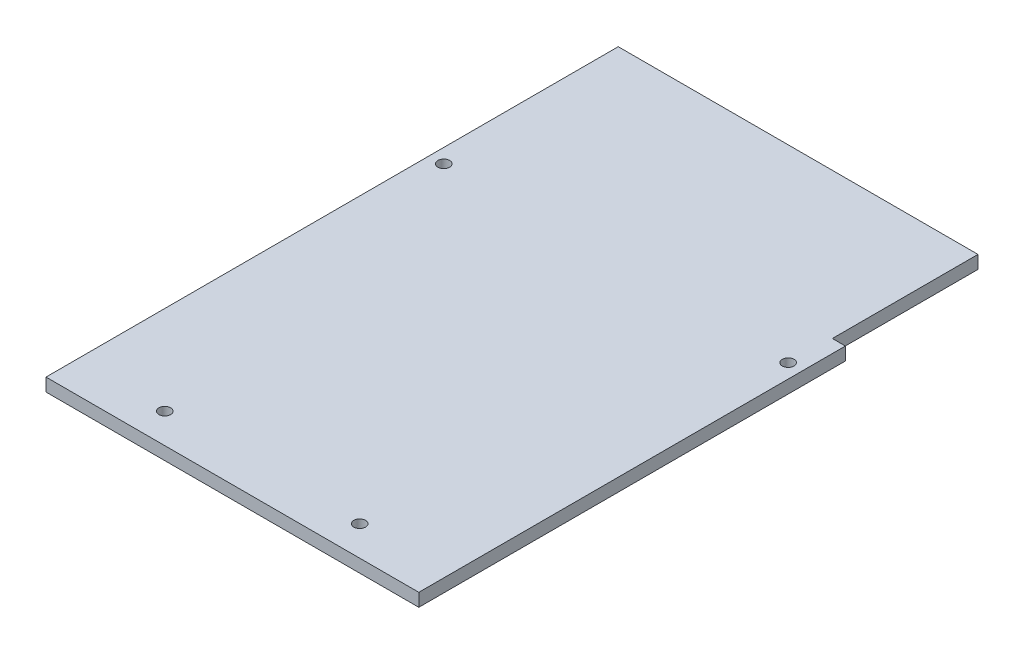
ISO-10303-21;
HEADER;
FILE_DESCRIPTION(('STEP AP214'),'2;1');
FILE_NAME('part.step','',(''),(''),'','','');
FILE_SCHEMA(('AUTOMOTIVE_DESIGN { 1 0 10303 214 1 1 1 1 }'));
ENDSEC;
DATA;
#1=APPLICATION_CONTEXT('core data for automotive mechanical design processes');
#2=APPLICATION_PROTOCOL_DEFINITION('international standard','automotive_design',2000,#1);
#3=PRODUCT_CONTEXT('',#1,'mechanical');
#4=PRODUCT('Part','Part','',(#3));
#5=PRODUCT_RELATED_PRODUCT_CATEGORY('part','',(#4));
#6=PRODUCT_DEFINITION_FORMATION('','',#4);
#7=PRODUCT_DEFINITION_CONTEXT('part definition',#1,'design');
#8=PRODUCT_DEFINITION('design','',#6,#7);
#9=PRODUCT_DEFINITION_SHAPE('','',#8);
#10=(LENGTH_UNIT() NAMED_UNIT(*) SI_UNIT(.MILLI.,.METRE.));
#11=(NAMED_UNIT(*) PLANE_ANGLE_UNIT() SI_UNIT($,.RADIAN.));
#12=(NAMED_UNIT(*) SI_UNIT($,.STERADIAN.) SOLID_ANGLE_UNIT());
#13=UNCERTAINTY_MEASURE_WITH_UNIT(LENGTH_MEASURE(1.E-05),#10,'distance_accuracy_value','');
#14=(GEOMETRIC_REPRESENTATION_CONTEXT(3) GLOBAL_UNCERTAINTY_ASSIGNED_CONTEXT((#13)) GLOBAL_UNIT_ASSIGNED_CONTEXT((#10,
#11,#12)) REPRESENTATION_CONTEXT('',''));
#15=CARTESIAN_POINT('',(0.,0.,0.));
#16=DIRECTION('',(0.,0.,1.));
#17=DIRECTION('',(1.,0.,0.));
#18=AXIS2_PLACEMENT_3D('',#15,#16,#17);
#19=CARTESIAN_POINT('',(-22.7879498550212,4.7625,83.462218404908));
#20=DIRECTION('',(1.,0.,0.));
#21=DIRECTION('',(0.,0.,-1.));
#22=AXIS2_PLACEMENT_3D('',#19,#20,#21);
#23=PLANE('',#22);
#24=DIRECTION('',(0.,0.,1.));
#25=VECTOR('',#24,1.);
#26=CARTESIAN_POINT('',(-22.7879498550212,0.,83.462218404908));
#27=LINE('',#26,#25);
#28=CARTESIAN_POINT('',(-22.7879498550212,0.,-126.087781595092));
#29=VERTEX_POINT('',#28);
#30=CARTESIAN_POINT('',(-22.7879498550212,0.,83.462218404908));
#31=VERTEX_POINT('',#30);
#32=EDGE_CURVE('E108',#29,#31,#27,.T.);
#33=ORIENTED_EDGE('',*,*,#32,.T.);
#34=DIRECTION('',(0.,-1.,0.));
#35=VECTOR('',#34,1.);
#36=CARTESIAN_POINT('',(-22.7879498550212,4.7625,83.462218404908));
#37=LINE('',#36,#35);
#38=CARTESIAN_POINT('',(-22.7879498550212,4.7625,83.462218404908));
#39=VERTEX_POINT('',#38);
#40=EDGE_CURVE('E11',#39,#31,#37,.T.);
#41=ORIENTED_EDGE('',*,*,#40,.F.);
#42=DIRECTION('',(0.,0.,1.));
#43=VECTOR('',#42,1.);
#44=CARTESIAN_POINT('',(-22.7879498550212,4.7625,83.462218404908));
#45=LINE('',#44,#43);
#46=CARTESIAN_POINT('',(-22.7879498550212,4.7625,-126.087781595092));
#47=VERTEX_POINT('',#46);
#48=EDGE_CURVE('E109',#47,#39,#45,.T.);
#49=ORIENTED_EDGE('',*,*,#48,.F.);
#50=DIRECTION('',(0.,-1.,0.));
#51=VECTOR('',#50,1.);
#52=CARTESIAN_POINT('',(-22.7879498550212,4.7625,-126.087781595092));
#53=LINE('',#52,#51);
#54=EDGE_CURVE('E118',#47,#29,#53,.T.);
#55=ORIENTED_EDGE('',*,*,#54,.T.);
#56=EDGE_LOOP('',(#33,#41,#49,#55));
#57=FACE_BOUND('',#56,.T.);
#58=ADVANCED_FACE('F34',(#57),#23,.F.);
#59=CARTESIAN_POINT('',(-22.7879498550212,4.7625,83.462218404908));
#60=DIRECTION('',(0.,0.,-1.));
#61=DIRECTION('',(-1.,0.,0.));
#62=AXIS2_PLACEMENT_3D('',#59,#60,#61);
#63=PLANE('',#62);
#64=DIRECTION('',(1.,0.,0.));
#65=VECTOR('',#64,1.);
#66=CARTESIAN_POINT('',(-22.7879498550212,0.,83.462218404908));
#67=LINE('',#66,#65);
#68=CARTESIAN_POINT('',(113.737050144979,0.,83.462218404908));
#69=VERTEX_POINT('',#68);
#70=EDGE_CURVE('E114',#31,#69,#67,.T.);
#71=ORIENTED_EDGE('',*,*,#70,.T.);
#72=DIRECTION('',(0.,-1.,0.));
#73=VECTOR('',#72,1.);
#74=CARTESIAN_POINT('',(113.737050144979,4.7625,83.462218404908));
#75=LINE('',#74,#73);
#76=CARTESIAN_POINT('',(113.737050144979,4.7625,83.462218404908));
#77=VERTEX_POINT('',#76);
#78=EDGE_CURVE('E41',#77,#69,#75,.T.);
#79=ORIENTED_EDGE('',*,*,#78,.F.);
#80=DIRECTION('',(1.,0.,0.));
#81=VECTOR('',#80,1.);
#82=CARTESIAN_POINT('',(-22.7879498550212,4.7625,83.462218404908));
#83=LINE('',#82,#81);
#84=EDGE_CURVE('E80',#39,#77,#83,.T.);
#85=ORIENTED_EDGE('',*,*,#84,.F.);
#86=ORIENTED_EDGE('',*,*,#40,.T.);
#87=EDGE_LOOP('',(#71,#79,#85,#86));
#88=FACE_BOUND('',#87,.T.);
#89=ADVANCED_FACE('F140',(#88),#63,.F.);
#90=CARTESIAN_POINT('',(113.737050144979,4.7625,83.462218404908));
#91=DIRECTION('',(-1.,0.,0.));
#92=DIRECTION('',(0.,0.,1.));
#93=AXIS2_PLACEMENT_3D('',#90,#91,#92);
#94=PLANE('',#93);
#95=DIRECTION('',(0.,0.,-1.));
#96=VECTOR('',#95,1.);
#97=CARTESIAN_POINT('',(113.737050144979,0.,83.462218404908));
#98=LINE('',#97,#96);
#99=CARTESIAN_POINT('',(113.737050144979,0.,-72.747781595092));
#100=VERTEX_POINT('',#99);
#101=EDGE_CURVE('E110',#69,#100,#98,.T.);
#102=ORIENTED_EDGE('',*,*,#101,.T.);
#103=DIRECTION('',(0.,1.,0.));
#104=VECTOR('',#103,1.);
#105=CARTESIAN_POINT('',(113.737050144979,0.,-72.747781595092));
#106=LINE('',#105,#104);
#107=CARTESIAN_POINT('',(113.737050144979,4.7625,-72.747781595092));
#108=VERTEX_POINT('',#107);
#109=EDGE_CURVE('E134',#100,#108,#106,.T.);
#110=ORIENTED_EDGE('',*,*,#109,.T.);
#111=DIRECTION('',(0.,0.,-1.));
#112=VECTOR('',#111,1.);
#113=CARTESIAN_POINT('',(113.737050144979,4.7625,83.462218404908));
#114=LINE('',#113,#112);
#115=EDGE_CURVE('E126',#77,#108,#114,.T.);
#116=ORIENTED_EDGE('',*,*,#115,.F.);
#117=ORIENTED_EDGE('',*,*,#78,.T.);
#118=EDGE_LOOP('',(#102,#110,#116,#117));
#119=FACE_BOUND('',#118,.T.);
#120=ADVANCED_FACE('F123',(#119),#94,.F.);
#121=CARTESIAN_POINT('',(-22.7879498550212,4.7625,-126.087781595092));
#122=DIRECTION('',(0.,0.,1.));
#123=DIRECTION('',(1.,0.,0.));
#124=AXIS2_PLACEMENT_3D('',#121,#122,#123);
#125=PLANE('',#124);
#126=DIRECTION('',(-1.,0.,0.));
#127=VECTOR('',#126,1.);
#128=CARTESIAN_POINT('',(-22.7879498550212,4.7625,-126.087781595092));
#129=LINE('',#128,#127);
#130=CARTESIAN_POINT('',(108.961850144979,4.7625,-126.087781595092));
#131=VERTEX_POINT('',#130);
#132=EDGE_CURVE('E57',#131,#47,#129,.T.);
#133=ORIENTED_EDGE('',*,*,#132,.F.);
#134=DIRECTION('',(0.,1.,0.));
#135=VECTOR('',#134,1.);
#136=CARTESIAN_POINT('',(108.961850144979,0.,-126.087781595092));
#137=LINE('',#136,#135);
#138=CARTESIAN_POINT('',(108.961850144979,0.,-126.087781595092));
#139=VERTEX_POINT('',#138);
#140=EDGE_CURVE('E98',#139,#131,#137,.T.);
#141=ORIENTED_EDGE('',*,*,#140,.F.);
#142=DIRECTION('',(-1.,0.,0.));
#143=VECTOR('',#142,1.);
#144=CARTESIAN_POINT('',(-22.7879498550212,0.,-126.087781595092));
#145=LINE('',#144,#143);
#146=EDGE_CURVE('E75',#139,#29,#145,.T.);
#147=ORIENTED_EDGE('',*,*,#146,.T.);
#148=ORIENTED_EDGE('',*,*,#54,.F.);
#149=EDGE_LOOP('',(#133,#141,#147,#148));
#150=FACE_BOUND('',#149,.T.);
#151=ADVANCED_FACE('F103',(#150),#125,.F.);
#152=CARTESIAN_POINT('',(0.,4.7625,0.));
#153=DIRECTION('',(0.,-1.,0.));
#154=DIRECTION('',(0.,0.,-1.));
#155=AXIS2_PLACEMENT_3D('',#152,#153,#154);
#156=PLANE('',#155);
#157=CARTESIAN_POINT('',(81.1615501449788,4.7625,72.5402184049079));
#158=DIRECTION('',(0.,1.,0.));
#159=DIRECTION('',(0.,0.,1.));
#160=AXIS2_PLACEMENT_3D('',#157,#158,#159);
#161=CIRCLE('',#160,2.15264999999999);
#162=CARTESIAN_POINT('',(81.1615501449788,4.7625,74.6928684049079));
#163=VERTEX_POINT('',#162);
#164=EDGE_CURVE('E176',#163,#163,#161,.T.);
#165=ORIENTED_EDGE('',*,*,#164,.F.);
#166=EDGE_LOOP('',(#165));
#167=FACE_BOUND('',#166,.T.);
#168=CARTESIAN_POINT('',(9.7875501449788,4.7625,72.5402184049079));
#169=DIRECTION('',(0.,1.,0.));
#170=DIRECTION('',(0.,0.,1.));
#171=AXIS2_PLACEMENT_3D('',#168,#169,#170);
#172=CIRCLE('',#171,2.15264999999999);
#173=CARTESIAN_POINT('',(9.7875501449788,4.7625,74.6928684049079));
#174=VERTEX_POINT('',#173);
#175=EDGE_CURVE('E180',#174,#174,#172,.T.);
#176=ORIENTED_EDGE('',*,*,#175,.F.);
#177=EDGE_LOOP('',(#176));
#178=FACE_BOUND('',#177,.T.);
#179=CARTESIAN_POINT('',(-17.5809498550212,4.7625,-56.9997815950921));
#180=DIRECTION('',(0.,1.,0.));
#181=DIRECTION('',(0.,0.,1.));
#182=AXIS2_PLACEMENT_3D('',#179,#180,#181);
#183=CIRCLE('',#182,2.15264999999999);
#184=CARTESIAN_POINT('',(-17.5809498550212,4.7625,-54.8471315950921));
#185=VERTEX_POINT('',#184);
#186=EDGE_CURVE('E184',#185,#185,#183,.T.);
#187=ORIENTED_EDGE('',*,*,#186,.F.);
#188=EDGE_LOOP('',(#187));
#189=FACE_BOUND('',#188,.T.);
#190=CARTESIAN_POINT('',(108.530050144979,4.7625,-56.9997815950921));
#191=DIRECTION('',(0.,1.,0.));
#192=DIRECTION('',(0.,0.,1.));
#193=AXIS2_PLACEMENT_3D('',#190,#191,#192);
#194=CIRCLE('',#193,2.15264999999999);
#195=CARTESIAN_POINT('',(108.530050144979,4.7625,-54.8471315950921));
#196=VERTEX_POINT('',#195);
#197=EDGE_CURVE('E187',#196,#196,#194,.T.);
#198=ORIENTED_EDGE('',*,*,#197,.F.);
#199=EDGE_LOOP('',(#198));
#200=FACE_BOUND('',#199,.T.);
#201=ORIENTED_EDGE('',*,*,#115,.T.);
#202=DIRECTION('',(1.,0.,0.));
#203=VECTOR('',#202,1.);
#204=CARTESIAN_POINT('',(113.737050144979,4.7625,-72.747781595092));
#205=LINE('',#204,#203);
#206=CARTESIAN_POINT('',(108.961850144979,4.7625,-72.747781595092));
#207=VERTEX_POINT('',#206);
#208=EDGE_CURVE('E101',#207,#108,#205,.T.);
#209=ORIENTED_EDGE('',*,*,#208,.F.);
#210=DIRECTION('',(0.,0.,1.));
#211=VECTOR('',#210,1.);
#212=CARTESIAN_POINT('',(108.961850144979,4.7625,-126.087781595092));
#213=LINE('',#212,#211);
#214=EDGE_CURVE('E130',#131,#207,#213,.T.);
#215=ORIENTED_EDGE('',*,*,#214,.F.);
#216=ORIENTED_EDGE('',*,*,#132,.T.);
#217=ORIENTED_EDGE('',*,*,#48,.T.);
#218=ORIENTED_EDGE('',*,*,#84,.T.);
#219=EDGE_LOOP('',(#201,#209,#215,#216,#217,#218));
#220=FACE_BOUND('',#219,.T.);
#221=ADVANCED_FACE('F144',(#167,#178,#189,#200,#220),#156,.F.);
#222=CARTESIAN_POINT('',(0.,0.,0.));
#223=DIRECTION('',(0.,-1.,0.));
#224=DIRECTION('',(0.,0.,-1.));
#225=AXIS2_PLACEMENT_3D('',#222,#223,#224);
#226=PLANE('',#225);
#227=CARTESIAN_POINT('',(81.1615501449788,0.,72.5402184049079));
#228=DIRECTION('',(0.,1.,0.));
#229=DIRECTION('',(0.,0.,1.));
#230=AXIS2_PLACEMENT_3D('',#227,#228,#229);
#231=CIRCLE('',#230,2.15265000000001);
#232=CARTESIAN_POINT('',(81.1615501449788,0.,74.6928684049079));
#233=VERTEX_POINT('',#232);
#234=EDGE_CURVE('E200',#233,#233,#231,.T.);
#235=ORIENTED_EDGE('',*,*,#234,.T.);
#236=EDGE_LOOP('',(#235));
#237=FACE_BOUND('',#236,.T.);
#238=CARTESIAN_POINT('',(9.7875501449788,0.,72.5402184049079));
#239=DIRECTION('',(0.,1.,0.));
#240=DIRECTION('',(0.,0.,1.));
#241=AXIS2_PLACEMENT_3D('',#238,#239,#240);
#242=CIRCLE('',#241,2.15265);
#243=CARTESIAN_POINT('',(9.7875501449788,0.,74.6928684049079));
#244=VERTEX_POINT('',#243);
#245=EDGE_CURVE('E196',#244,#244,#242,.T.);
#246=ORIENTED_EDGE('',*,*,#245,.T.);
#247=EDGE_LOOP('',(#246));
#248=FACE_BOUND('',#247,.T.);
#249=CARTESIAN_POINT('',(-17.5809498550212,0.,-56.9997815950921));
#250=DIRECTION('',(0.,1.,0.));
#251=DIRECTION('',(0.,0.,1.));
#252=AXIS2_PLACEMENT_3D('',#249,#250,#251);
#253=CIRCLE('',#252,2.15265);
#254=CARTESIAN_POINT('',(-17.5809498550212,0.,-54.8471315950921));
#255=VERTEX_POINT('',#254);
#256=EDGE_CURVE('E189',#255,#255,#253,.T.);
#257=ORIENTED_EDGE('',*,*,#256,.T.);
#258=EDGE_LOOP('',(#257));
#259=FACE_BOUND('',#258,.T.);
#260=CARTESIAN_POINT('',(108.530050144979,0.,-56.9997815950921));
#261=DIRECTION('',(0.,1.,0.));
#262=DIRECTION('',(0.,0.,1.));
#263=AXIS2_PLACEMENT_3D('',#260,#261,#262);
#264=CIRCLE('',#263,2.15264999999999);
#265=CARTESIAN_POINT('',(108.530050144979,0.,-54.8471315950921));
#266=VERTEX_POINT('',#265);
#267=EDGE_CURVE('E132',#266,#266,#264,.T.);
#268=ORIENTED_EDGE('',*,*,#267,.T.);
#269=EDGE_LOOP('',(#268));
#270=FACE_BOUND('',#269,.T.);
#271=DIRECTION('',(1.,0.,0.));
#272=VECTOR('',#271,1.);
#273=CARTESIAN_POINT('',(113.737050144979,0.,-72.747781595092));
#274=LINE('',#273,#272);
#275=CARTESIAN_POINT('',(108.961850144979,0.,-72.747781595092));
#276=VERTEX_POINT('',#275);
#277=EDGE_CURVE('E48',#276,#100,#274,.T.);
#278=ORIENTED_EDGE('',*,*,#277,.T.);
#279=ORIENTED_EDGE('',*,*,#101,.F.);
#280=ORIENTED_EDGE('',*,*,#70,.F.);
#281=ORIENTED_EDGE('',*,*,#32,.F.);
#282=ORIENTED_EDGE('',*,*,#146,.F.);
#283=DIRECTION('',(0.,0.,1.));
#284=VECTOR('',#283,1.);
#285=CARTESIAN_POINT('',(108.961850144979,0.,-126.087781595092));
#286=LINE('',#285,#284);
#287=EDGE_CURVE('E95',#139,#276,#286,.T.);
#288=ORIENTED_EDGE('',*,*,#287,.T.);
#289=EDGE_LOOP('',(#278,#279,#280,#281,#282,#288));
#290=FACE_BOUND('',#289,.T.);
#291=ADVANCED_FACE('F106',(#237,#248,#259,#270,#290),#226,.T.);
#292=CARTESIAN_POINT('',(113.737050144979,0.,-72.747781595092));
#293=DIRECTION('',(0.,0.,1.));
#294=DIRECTION('',(1.,0.,0.));
#295=AXIS2_PLACEMENT_3D('',#292,#293,#294);
#296=PLANE('',#295);
#297=ORIENTED_EDGE('',*,*,#208,.T.);
#298=ORIENTED_EDGE('',*,*,#109,.F.);
#299=ORIENTED_EDGE('',*,*,#277,.F.);
#300=DIRECTION('',(0.,1.,0.));
#301=VECTOR('',#300,1.);
#302=CARTESIAN_POINT('',(108.961850144979,0.,-72.747781595092));
#303=LINE('',#302,#301);
#304=EDGE_CURVE('E99',#276,#207,#303,.T.);
#305=ORIENTED_EDGE('',*,*,#304,.T.);
#306=EDGE_LOOP('',(#297,#298,#299,#305));
#307=FACE_BOUND('',#306,.T.);
#308=ADVANCED_FACE('F146',(#307),#296,.F.);
#309=CARTESIAN_POINT('',(108.961850144979,0.,-126.087781595092));
#310=DIRECTION('',(-1.,0.,0.));
#311=DIRECTION('',(0.,0.,1.));
#312=AXIS2_PLACEMENT_3D('',#309,#310,#311);
#313=PLANE('',#312);
#314=ORIENTED_EDGE('',*,*,#214,.T.);
#315=ORIENTED_EDGE('',*,*,#304,.F.);
#316=ORIENTED_EDGE('',*,*,#287,.F.);
#317=ORIENTED_EDGE('',*,*,#140,.T.);
#318=EDGE_LOOP('',(#314,#315,#316,#317));
#319=FACE_BOUND('',#318,.T.);
#320=ADVANCED_FACE('F97',(#319),#313,.F.);
#321=CARTESIAN_POINT('',(108.530050144979,4.7625,-56.9997815950921));
#322=DIRECTION('',(0.,1.,0.));
#323=DIRECTION('',(0.,0.,1.));
#324=AXIS2_PLACEMENT_3D('',#321,#322,#323);
#325=CYLINDRICAL_SURFACE('',#324,2.15264999999999);
#326=ORIENTED_EDGE('',*,*,#267,.F.);
#327=EDGE_LOOP('',(#326));
#328=FACE_BOUND('',#327,.T.);
#329=ORIENTED_EDGE('',*,*,#197,.T.);
#330=EDGE_LOOP('',(#329));
#331=FACE_BOUND('',#330,.T.);
#332=ADVANCED_FACE('F153',(#328,#331),#325,.F.);
#333=CARTESIAN_POINT('',(-17.5809498550212,4.7625,-56.9997815950921));
#334=DIRECTION('',(0.,1.,0.));
#335=DIRECTION('',(0.,0.,1.));
#336=AXIS2_PLACEMENT_3D('',#333,#334,#335);
#337=CYLINDRICAL_SURFACE('',#336,2.15264999999999);
#338=ORIENTED_EDGE('',*,*,#256,.F.);
#339=EDGE_LOOP('',(#338));
#340=FACE_BOUND('',#339,.T.);
#341=ORIENTED_EDGE('',*,*,#186,.T.);
#342=EDGE_LOOP('',(#341));
#343=FACE_BOUND('',#342,.T.);
#344=ADVANCED_FACE('F212',(#340,#343),#337,.F.);
#345=CARTESIAN_POINT('',(9.7875501449788,4.7625,72.5402184049079));
#346=DIRECTION('',(0.,1.,0.));
#347=DIRECTION('',(0.,0.,1.));
#348=AXIS2_PLACEMENT_3D('',#345,#346,#347);
#349=CYLINDRICAL_SURFACE('',#348,2.15264999999999);
#350=ORIENTED_EDGE('',*,*,#245,.F.);
#351=EDGE_LOOP('',(#350));
#352=FACE_BOUND('',#351,.T.);
#353=ORIENTED_EDGE('',*,*,#175,.T.);
#354=EDGE_LOOP('',(#353));
#355=FACE_BOUND('',#354,.T.);
#356=ADVANCED_FACE('F206',(#352,#355),#349,.F.);
#357=CARTESIAN_POINT('',(81.1615501449788,4.7625,72.5402184049079));
#358=DIRECTION('',(0.,1.,0.));
#359=DIRECTION('',(0.,0.,1.));
#360=AXIS2_PLACEMENT_3D('',#357,#358,#359);
#361=CYLINDRICAL_SURFACE('',#360,2.15265);
#362=ORIENTED_EDGE('',*,*,#234,.F.);
#363=EDGE_LOOP('',(#362));
#364=FACE_BOUND('',#363,.T.);
#365=ORIENTED_EDGE('',*,*,#164,.T.);
#366=EDGE_LOOP('',(#365));
#367=FACE_BOUND('',#366,.T.);
#368=ADVANCED_FACE('F204',(#364,#367),#361,.F.);
#369=CLOSED_SHELL('',(#58,#89,#120,#151,#221,#291,#308,#320,#332,#344,#356,#368));
#370=MANIFOLD_SOLID_BREP('B2',#369);
#371=ADVANCED_BREP_SHAPE_REPRESENTATION('',(#18,#370),#14);
#372=SHAPE_DEFINITION_REPRESENTATION(#9,#371);
ENDSEC;
END-ISO-10303-21;
